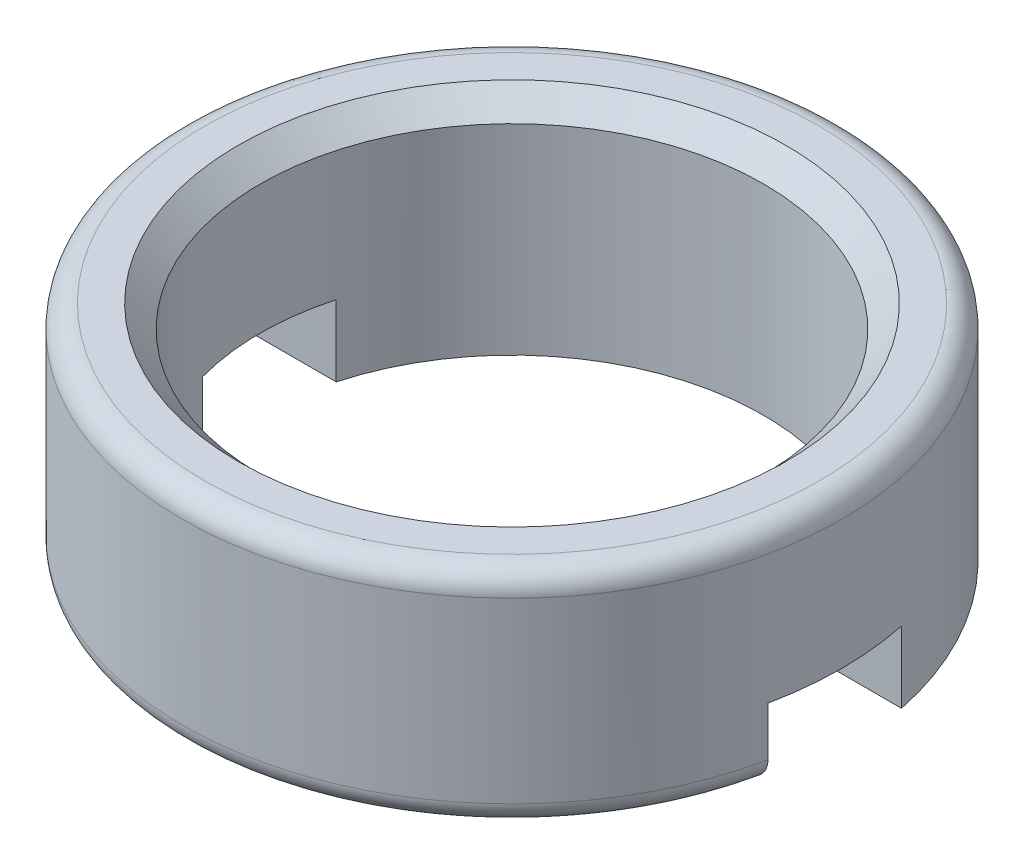
ISO-10303-21;
HEADER;
FILE_DESCRIPTION(('STEP AP214'),'2;1');
FILE_NAME('part.step','',(''),(''),'','','');
FILE_SCHEMA(('AUTOMOTIVE_DESIGN { 1 0 10303 214 1 1 1 1 }'));
ENDSEC;
DATA;
#1=APPLICATION_CONTEXT('core data for automotive mechanical design processes');
#2=APPLICATION_PROTOCOL_DEFINITION('international standard','automotive_design',2000,#1);
#3=PRODUCT_CONTEXT('',#1,'mechanical');
#4=PRODUCT('Part','Part','',(#3));
#5=PRODUCT_RELATED_PRODUCT_CATEGORY('part','',(#4));
#6=PRODUCT_DEFINITION_FORMATION('','',#4);
#7=PRODUCT_DEFINITION_CONTEXT('part definition',#1,'design');
#8=PRODUCT_DEFINITION('design','',#6,#7);
#9=PRODUCT_DEFINITION_SHAPE('','',#8);
#10=(LENGTH_UNIT() NAMED_UNIT(*) SI_UNIT(.MILLI.,.METRE.));
#11=(NAMED_UNIT(*) PLANE_ANGLE_UNIT() SI_UNIT($,.RADIAN.));
#12=(NAMED_UNIT(*) SI_UNIT($,.STERADIAN.) SOLID_ANGLE_UNIT());
#13=UNCERTAINTY_MEASURE_WITH_UNIT(LENGTH_MEASURE(1.E-05),#10,'distance_accuracy_value','');
#14=(GEOMETRIC_REPRESENTATION_CONTEXT(3) GLOBAL_UNCERTAINTY_ASSIGNED_CONTEXT((#13)) GLOBAL_UNIT_ASSIGNED_CONTEXT((#10,
#11,#12)) REPRESENTATION_CONTEXT('',''));
#15=CARTESIAN_POINT('',(0.,0.,0.));
#16=DIRECTION('',(0.,0.,1.));
#17=DIRECTION('',(1.,0.,0.));
#18=AXIS2_PLACEMENT_3D('',#15,#16,#17);
#19=CARTESIAN_POINT('',(0.,0.,0.));
#20=DIRECTION('',(0.,1.,0.));
#21=DIRECTION('',(0.,0.,1.));
#22=AXIS2_PLACEMENT_3D('',#19,#20,#21);
#23=PLANE('',#22);
#24=DIRECTION('',(-1.,0.,0.));
#25=VECTOR('',#24,1.);
#26=CARTESIAN_POINT('',(-13.7487402626277,0.,-1.5));
#27=LINE('',#26,#25);
#28=CARTESIAN_POINT('',(-5.4472470111057,0.,-1.5));
#29=VERTEX_POINT('',#28);
#30=CARTESIAN_POINT('',(-7.24637840579693,0.,-1.5));
#31=VERTEX_POINT('',#30);
#32=EDGE_CURVE('E126',#29,#31,#27,.T.);
#33=ORIENTED_EDGE('',*,*,#32,.T.);
#34=CARTESIAN_POINT('',(0.,0.,0.));
#35=DIRECTION('',(0.,1.,0.));
#36=DIRECTION('',(0.,0.,1.));
#37=AXIS2_PLACEMENT_3D('',#34,#35,#36);
#38=CIRCLE('',#37,7.4);
#39=CARTESIAN_POINT('',(7.24637840579693,0.,-1.5));
#40=VERTEX_POINT('',#39);
#41=EDGE_CURVE('E133',#40,#31,#38,.T.);
#42=ORIENTED_EDGE('',*,*,#41,.F.);
#43=CARTESIAN_POINT('',(5.4472470111057,0.,-1.5));
#44=VERTEX_POINT('',#43);
#45=EDGE_CURVE('E113',#40,#44,#27,.T.);
#46=ORIENTED_EDGE('',*,*,#45,.T.);
#47=CARTESIAN_POINT('',(0.,0.,0.));
#48=DIRECTION('',(0.,1.,0.));
#49=DIRECTION('',(0.,0.,1.));
#50=AXIS2_PLACEMENT_3D('',#47,#48,#49);
#51=CIRCLE('',#50,5.65);
#52=EDGE_CURVE('E141',#44,#29,#51,.T.);
#53=ORIENTED_EDGE('',*,*,#52,.T.);
#54=EDGE_LOOP('',(#33,#42,#46,#53));
#55=FACE_BOUND('',#54,.T.);
#56=ADVANCED_FACE('F35',(#55),#23,.F.);
#57=DIRECTION('',(1.,0.,0.));
#58=VECTOR('',#57,1.);
#59=CARTESIAN_POINT('',(-13.7487402626277,0.,1.5));
#60=LINE('',#59,#58);
#61=CARTESIAN_POINT('',(-6.73498329619309,0.,1.5));
#62=VERTEX_POINT('',#61);
#63=CARTESIAN_POINT('',(-5.96426860562131,0.,1.5));
#64=VERTEX_POINT('',#63);
#65=EDGE_CURVE('E238',#62,#64,#60,.T.);
#66=ORIENTED_EDGE('',*,*,#65,.T.);
#67=CARTESIAN_POINT('',(0.,0.,0.));
#68=DIRECTION('',(0.,1.,0.));
#69=DIRECTION('',(0.,0.,1.));
#70=AXIS2_PLACEMENT_3D('',#67,#68,#69);
#71=CIRCLE('',#70,6.15);
#72=CARTESIAN_POINT('',(5.96426860562131,0.,1.5));
#73=VERTEX_POINT('',#72);
#74=EDGE_CURVE('E159',#64,#73,#71,.T.);
#75=ORIENTED_EDGE('',*,*,#74,.T.);
#76=CARTESIAN_POINT('',(6.73498329619309,0.,1.5));
#77=VERTEX_POINT('',#76);
#78=EDGE_CURVE('E125',#73,#77,#60,.T.);
#79=ORIENTED_EDGE('',*,*,#78,.T.);
#80=CARTESIAN_POINT('',(0.,0.,0.));
#81=DIRECTION('',(0.,1.,0.));
#82=DIRECTION('',(0.,0.,1.));
#83=AXIS2_PLACEMENT_3D('',#80,#81,#82);
#84=CIRCLE('',#83,6.9);
#85=EDGE_CURVE('E157',#77,#62,#84,.F.);
#86=ORIENTED_EDGE('',*,*,#85,.T.);
#87=EDGE_LOOP('',(#66,#75,#79,#86));
#88=FACE_BOUND('',#87,.T.);
#89=ADVANCED_FACE('F207',(#88),#23,.F.);
#90=CARTESIAN_POINT('',(0.,5.,0.));
#91=DIRECTION('',(0.,-1.,0.));
#92=DIRECTION('',(0.,0.,-1.));
#93=AXIS2_PLACEMENT_3D('',#90,#91,#92);
#94=CYLINDRICAL_SURFACE('',#93,7.4);
#95=CARTESIAN_POINT('',(0.,4.5,0.));
#96=DIRECTION('',(0.,1.,0.));
#97=DIRECTION('',(0.,0.,1.));
#98=AXIS2_PLACEMENT_3D('',#95,#96,#97);
#99=CIRCLE('',#98,7.4);
#100=CARTESIAN_POINT('',(0.,4.5,7.4));
#101=VERTEX_POINT('',#100);
#102=EDGE_CURVE('E256',#101,#101,#99,.F.);
#103=ORIENTED_EDGE('',*,*,#102,.T.);
#104=EDGE_LOOP('',(#103));
#105=FACE_BOUND('',#104,.T.);
#106=DIRECTION('',(0.,-1.,0.));
#107=VECTOR('',#106,1.);
#108=CARTESIAN_POINT('',(-7.24637840579693,5.,1.5));
#109=LINE('',#108,#107);
#110=CARTESIAN_POINT('',(-7.24637840579693,0.5,1.5));
#111=VERTEX_POINT('',#110);
#112=CARTESIAN_POINT('',(-7.24637840579693,1.6,1.5));
#113=VERTEX_POINT('',#112);
#114=EDGE_CURVE('E233',#111,#113,#109,.F.);
#115=ORIENTED_EDGE('',*,*,#114,.F.);
#116=CARTESIAN_POINT('',(0.,0.5,0.));
#117=DIRECTION('',(0.,1.,0.));
#118=DIRECTION('',(0.,0.,1.));
#119=AXIS2_PLACEMENT_3D('',#116,#117,#118);
#120=CIRCLE('',#119,7.4);
#121=CARTESIAN_POINT('',(7.24637840579693,0.5,1.5));
#122=VERTEX_POINT('',#121);
#123=EDGE_CURVE('E254',#111,#122,#120,.T.);
#124=ORIENTED_EDGE('',*,*,#123,.T.);
#125=DIRECTION('',(0.,-1.,0.));
#126=VECTOR('',#125,1.);
#127=CARTESIAN_POINT('',(7.24637840579693,5.,1.5));
#128=LINE('',#127,#126);
#129=CARTESIAN_POINT('',(7.24637840579693,1.6,1.5));
#130=VERTEX_POINT('',#129);
#131=EDGE_CURVE('E137',#130,#122,#128,.T.);
#132=ORIENTED_EDGE('',*,*,#131,.F.);
#133=CARTESIAN_POINT('',(0.,1.6,0.));
#134=DIRECTION('',(0.,1.,0.));
#135=DIRECTION('',(0.,0.,1.));
#136=AXIS2_PLACEMENT_3D('',#133,#134,#135);
#137=CIRCLE('',#136,7.4);
#138=CARTESIAN_POINT('',(7.24637840579693,1.6,-1.5));
#139=VERTEX_POINT('',#138);
#140=EDGE_CURVE('E135',#130,#139,#137,.T.);
#141=ORIENTED_EDGE('',*,*,#140,.T.);
#142=DIRECTION('',(0.,-1.,0.));
#143=VECTOR('',#142,1.);
#144=CARTESIAN_POINT('',(7.24637840579693,5.,-1.5));
#145=LINE('',#144,#143);
#146=EDGE_CURVE('E117',#40,#139,#145,.F.);
#147=ORIENTED_EDGE('',*,*,#146,.F.);
#148=ORIENTED_EDGE('',*,*,#41,.T.);
#149=DIRECTION('',(0.,-1.,0.));
#150=VECTOR('',#149,1.);
#151=CARTESIAN_POINT('',(-7.24637840579693,5.,-1.5));
#152=LINE('',#151,#150);
#153=CARTESIAN_POINT('',(-7.24637840579693,1.6,-1.5));
#154=VERTEX_POINT('',#153);
#155=EDGE_CURVE('E136',#154,#31,#152,.T.);
#156=ORIENTED_EDGE('',*,*,#155,.F.);
#157=EDGE_CURVE('E235',#154,#113,#137,.T.);
#158=ORIENTED_EDGE('',*,*,#157,.T.);
#159=EDGE_LOOP('',(#115,#124,#132,#141,#147,#148,#156,#158));
#160=FACE_BOUND('',#159,.T.);
#161=ADVANCED_FACE('F131',(#105,#160),#94,.T.);
#162=CARTESIAN_POINT('',(0.,5.,0.));
#163=DIRECTION('',(0.,-1.,0.));
#164=DIRECTION('',(0.,0.,-1.));
#165=AXIS2_PLACEMENT_3D('',#162,#163,#164);
#166=CYLINDRICAL_SURFACE('',#165,5.65);
#167=CARTESIAN_POINT('',(0.,4.49999999999999,0.));
#168=DIRECTION('',(0.,1.,0.));
#169=DIRECTION('',(0.,0.,1.));
#170=AXIS2_PLACEMENT_3D('',#167,#168,#169);
#171=CIRCLE('',#170,5.65);
#172=CARTESIAN_POINT('',(0.,4.49999999999999,5.65));
#173=VERTEX_POINT('',#172);
#174=EDGE_CURVE('E43',#173,#173,#171,.T.);
#175=ORIENTED_EDGE('',*,*,#174,.T.);
#176=EDGE_LOOP('',(#175));
#177=FACE_BOUND('',#176,.T.);
#178=DIRECTION('',(0.,-1.,0.));
#179=VECTOR('',#178,1.);
#180=CARTESIAN_POINT('',(5.4472470111057,5.,1.5));
#181=LINE('',#180,#179);
#182=CARTESIAN_POINT('',(5.4472470111057,1.6,1.5));
#183=VERTEX_POINT('',#182);
#184=CARTESIAN_POINT('',(5.4472470111057,0.5,1.5));
#185=VERTEX_POINT('',#184);
#186=EDGE_CURVE('E154',#183,#185,#181,.T.);
#187=ORIENTED_EDGE('',*,*,#186,.T.);
#188=CARTESIAN_POINT('',(0.,0.5,0.));
#189=DIRECTION('',(0.,1.,0.));
#190=DIRECTION('',(0.,0.,1.));
#191=AXIS2_PLACEMENT_3D('',#188,#189,#190);
#192=CIRCLE('',#191,5.65);
#193=CARTESIAN_POINT('',(-5.4472470111057,0.5,1.5));
#194=VERTEX_POINT('',#193);
#195=EDGE_CURVE('E58',#185,#194,#192,.F.);
#196=ORIENTED_EDGE('',*,*,#195,.T.);
#197=DIRECTION('',(0.,-1.,0.));
#198=VECTOR('',#197,1.);
#199=CARTESIAN_POINT('',(-5.4472470111057,5.,1.5));
#200=LINE('',#199,#198);
#201=CARTESIAN_POINT('',(-5.4472470111057,1.6,1.5));
#202=VERTEX_POINT('',#201);
#203=EDGE_CURVE('E144',#194,#202,#200,.F.);
#204=ORIENTED_EDGE('',*,*,#203,.T.);
#205=CARTESIAN_POINT('',(0.,1.6,0.));
#206=DIRECTION('',(0.,1.,0.));
#207=DIRECTION('',(0.,0.,1.));
#208=AXIS2_PLACEMENT_3D('',#205,#206,#207);
#209=CIRCLE('',#208,5.65);
#210=CARTESIAN_POINT('',(-5.4472470111057,1.6,-1.5));
#211=VERTEX_POINT('',#210);
#212=EDGE_CURVE('E140',#211,#202,#209,.T.);
#213=ORIENTED_EDGE('',*,*,#212,.F.);
#214=DIRECTION('',(0.,-1.,0.));
#215=VECTOR('',#214,1.);
#216=CARTESIAN_POINT('',(-5.4472470111057,5.,-1.5));
#217=LINE('',#216,#215);
#218=EDGE_CURVE('E151',#211,#29,#217,.T.);
#219=ORIENTED_EDGE('',*,*,#218,.T.);
#220=ORIENTED_EDGE('',*,*,#52,.F.);
#221=DIRECTION('',(0.,-1.,0.));
#222=VECTOR('',#221,1.);
#223=CARTESIAN_POINT('',(5.4472470111057,5.,-1.5));
#224=LINE('',#223,#222);
#225=CARTESIAN_POINT('',(5.4472470111057,1.6,-1.5));
#226=VERTEX_POINT('',#225);
#227=EDGE_CURVE('E120',#44,#226,#224,.F.);
#228=ORIENTED_EDGE('',*,*,#227,.T.);
#229=EDGE_CURVE('E146',#183,#226,#209,.T.);
#230=ORIENTED_EDGE('',*,*,#229,.F.);
#231=EDGE_LOOP('',(#187,#196,#204,#213,#219,#220,#228,#230));
#232=FACE_BOUND('',#231,.T.);
#233=ADVANCED_FACE('F206',(#177,#232),#166,.F.);
#234=CARTESIAN_POINT('',(0.,5.,0.));
#235=DIRECTION('',(0.,1.,0.));
#236=DIRECTION('',(0.,0.,1.));
#237=AXIS2_PLACEMENT_3D('',#234,#235,#236);
#238=PLANE('',#237);
#239=CARTESIAN_POINT('',(0.,5.,0.));
#240=DIRECTION('',(0.,1.,0.));
#241=DIRECTION('',(0.,0.,1.));
#242=AXIS2_PLACEMENT_3D('',#239,#240,#241);
#243=CIRCLE('',#242,6.15000000000001);
#244=CARTESIAN_POINT('',(0.,5.,6.15000000000001));
#245=VERTEX_POINT('',#244);
#246=EDGE_CURVE('E11',#245,#245,#243,.F.);
#247=ORIENTED_EDGE('',*,*,#246,.T.);
#248=EDGE_LOOP('',(#247));
#249=FACE_BOUND('',#248,.T.);
#250=CARTESIAN_POINT('',(0.,5.,0.));
#251=DIRECTION('',(0.,1.,0.));
#252=DIRECTION('',(0.,0.,1.));
#253=AXIS2_PLACEMENT_3D('',#250,#251,#252);
#254=CIRCLE('',#253,6.9);
#255=CARTESIAN_POINT('',(0.,5.,6.9));
#256=VERTEX_POINT('',#255);
#257=EDGE_CURVE('E195',#256,#256,#254,.T.);
#258=ORIENTED_EDGE('',*,*,#257,.T.);
#259=EDGE_LOOP('',(#258));
#260=FACE_BOUND('',#259,.T.);
#261=ADVANCED_FACE('F211',(#249,#260),#238,.T.);
#262=CARTESIAN_POINT('',(13.7487402626277,1.6,1.5));
#263=DIRECTION('',(0.,1.,0.));
#264=DIRECTION('',(0.,0.,1.));
#265=AXIS2_PLACEMENT_3D('',#262,#263,#264);
#266=PLANE('',#265);
#267=DIRECTION('',(-1.,0.,0.));
#268=VECTOR('',#267,1.);
#269=CARTESIAN_POINT('',(-13.7487402626277,1.6,-1.5));
#270=LINE('',#269,#268);
#271=EDGE_CURVE('E228',#211,#154,#270,.T.);
#272=ORIENTED_EDGE('',*,*,#271,.F.);
#273=ORIENTED_EDGE('',*,*,#212,.T.);
#274=DIRECTION('',(1.,0.,0.));
#275=VECTOR('',#274,1.);
#276=CARTESIAN_POINT('',(-13.7487402626277,1.6,1.5));
#277=LINE('',#276,#275);
#278=EDGE_CURVE('E237',#113,#202,#277,.T.);
#279=ORIENTED_EDGE('',*,*,#278,.F.);
#280=ORIENTED_EDGE('',*,*,#157,.F.);
#281=EDGE_LOOP('',(#272,#273,#279,#280));
#282=FACE_BOUND('',#281,.T.);
#283=ADVANCED_FACE('F214',(#282),#266,.F.);
#284=CARTESIAN_POINT('',(-13.7487402626277,1.6,1.5));
#285=DIRECTION('',(0.,0.,-1.));
#286=DIRECTION('',(-1.,0.,0.));
#287=AXIS2_PLACEMENT_3D('',#284,#285,#286);
#288=PLANE('',#287);
#289=ORIENTED_EDGE('',*,*,#203,.F.);
#290=CARTESIAN_POINT('',(-5.4472470111057,0.5,1.5));
#291=CARTESIAN_POINT('',(-5.44721865654353,0.472579999335546,1.5));
#292=CARTESIAN_POINT('',(-5.44958468785448,0.445173572933267,1.5));
#293=CARTESIAN_POINT('',(-5.458888354602,0.391197751948108,1.5));
#294=CARTESIAN_POINT('',(-5.4658175807584,0.364626911698731,1.5));
#295=CARTESIAN_POINT('',(-5.48403282879274,0.31302319140128,1.5));
#296=CARTESIAN_POINT('',(-5.49531928909857,0.287990466413323,1.5));
#297=CARTESIAN_POINT('',(-5.52186729528403,0.240131540818763,1.5));
#298=CARTESIAN_POINT('',(-5.5371293523342,0.217305624474995,1.5));
#299=CARTESIAN_POINT('',(-5.57143211389376,0.174090219625326,1.5));
#300=CARTESIAN_POINT('',(-5.59053001164644,0.153746176722995,1.5));
#301=CARTESIAN_POINT('',(-5.63177366020328,0.116423136103547,1.5));
#302=CARTESIAN_POINT('',(-5.65392019360701,0.0994450051719816,1.5));
#303=CARTESIAN_POINT('',(-5.70142475948531,0.0687372641111311,1.5));
#304=CARTESIAN_POINT('',(-5.7268657220437,0.0551360388314988,1.5));
#305=CARTESIAN_POINT('',(-5.77962307713032,0.032265449001897,1.5));
#306=CARTESIAN_POINT('',(-5.806939136347,0.0229953168450117,1.5));
#307=CARTESIAN_POINT('',(-5.85596990209994,0.0106850033498839,1.5));
#308=CARTESIAN_POINT('',(-5.87744852082027,0.00668194596631475,1.5));
#309=CARTESIAN_POINT('',(-5.92070537034321,0.0013392326078589,1.5));
#310=CARTESIAN_POINT('',(-5.94248316414683,-3.96248657095503E-06,1.5));
#311=CARTESIAN_POINT('',(-5.96426860562131,0.,1.5));
#312=B_SPLINE_CURVE_WITH_KNOTS('',3,(#290,#291,#292,#293,#294,#295,#296,#297,#298,#299,#300,
#301,#302,#303,#304,#305,#306,#307,#308,#309,#310,#311),.UNSPECIFIED.,.F.,.F.,(4,2,2,2,2,2,2,2,
2,2,4),(0.,0.0821374513729526,0.164123957803793,0.246118715924156,0.328124021898044,
0.411457427519352,0.494812265261529,0.5809690962749,0.667110651770398,0.732498131507457,
0.797798550340366),.UNSPECIFIED.);
#313=EDGE_CURVE('E190',#194,#64,#312,.T.);
#314=ORIENTED_EDGE('',*,*,#313,.T.);
#315=ORIENTED_EDGE('',*,*,#65,.F.);
#316=CARTESIAN_POINT('',(-6.73498329619309,0.,1.5));
#317=CARTESIAN_POINT('',(-6.76425817964081,-2.19342776803566E-05,1.5));
#318=CARTESIAN_POINT('',(-6.79353132328341,0.00244839274102724,1.5));
#319=CARTESIAN_POINT('',(-6.85125761613455,0.012227360179828,1.5));
#320=CARTESIAN_POINT('',(-6.87971078170866,0.019535903966283,1.5));
#321=CARTESIAN_POINT('',(-6.93500362915463,0.0388527193332894,1.5));
#322=CARTESIAN_POINT('',(-6.96184202108156,0.0508646921696409,1.5));
#323=CARTESIAN_POINT('',(-7.01307651654304,0.0792745375587574,1.5));
#324=CARTESIAN_POINT('',(-7.03747361030847,0.0956706218524248,1.5));
#325=CARTESIAN_POINT('',(-7.08280016099415,0.132184844633778,1.5));
#326=CARTESIAN_POINT('',(-7.10376924419293,0.15225376122961,1.5));
#327=CARTESIAN_POINT('',(-7.14195445368811,0.19570247589938,1.5));
#328=CARTESIAN_POINT('',(-7.15917000854065,0.219082777211918,1.5));
#329=CARTESIAN_POINT('',(-7.1889592815937,0.267942991810473,1.5));
#330=CARTESIAN_POINT('',(-7.2016246440354,0.293367112861258,1.5));
#331=CARTESIAN_POINT('',(-7.22240677214829,0.34600016326984,1.5));
#332=CARTESIAN_POINT('',(-7.23052761863195,0.373207466784818,1.5));
#333=CARTESIAN_POINT('',(-7.23961482541372,0.417194055967998,1.5));
#334=CARTESIAN_POINT('',(-7.24214983809906,0.43366486133373,1.5));
#335=CARTESIAN_POINT('',(-7.2455310576269,0.466754488919006,1.5));
#336=CARTESIAN_POINT('',(-7.24637973131355,0.483373059155743,1.5));
#337=CARTESIAN_POINT('',(-7.24637840579782,0.499999999999815,1.5));
#338=B_SPLINE_CURVE_WITH_KNOTS('',3,(#316,#317,#318,#319,#320,#321,#322,#323,#324,#325,#326,
#327,#328,#329,#330,#331,#332,#333,#334,#335,#336,#337),.UNSPECIFIED.,.F.,.F.,(4,2,2,2,2,2,2,2,
2,2,4),(0.,0.0877189192426712,0.175436086529411,0.263222420007344,0.350973000319704,
0.437623846052012,0.524287874466903,0.609093009099696,0.693821869061419,0.743737742041637,
0.79358054217184),.UNSPECIFIED.);
#339=EDGE_CURVE('E50',#62,#111,#338,.T.);
#340=ORIENTED_EDGE('',*,*,#339,.T.);
#341=ORIENTED_EDGE('',*,*,#114,.T.);
#342=ORIENTED_EDGE('',*,*,#278,.T.);
#343=EDGE_LOOP('',(#289,#314,#315,#340,#341,#342));
#344=FACE_BOUND('',#343,.T.);
#345=ADVANCED_FACE('F220',(#344),#288,.T.);
#346=CARTESIAN_POINT('',(-13.7487402626277,1.6,-1.5));
#347=DIRECTION('',(0.,0.,1.));
#348=DIRECTION('',(1.,0.,0.));
#349=AXIS2_PLACEMENT_3D('',#346,#347,#348);
#350=PLANE('',#349);
#351=ORIENTED_EDGE('',*,*,#155,.T.);
#352=ORIENTED_EDGE('',*,*,#32,.F.);
#353=ORIENTED_EDGE('',*,*,#218,.F.);
#354=ORIENTED_EDGE('',*,*,#271,.T.);
#355=EDGE_LOOP('',(#351,#352,#353,#354));
#356=FACE_BOUND('',#355,.T.);
#357=ADVANCED_FACE('F218',(#356),#350,.T.);
#358=ORIENTED_EDGE('',*,*,#146,.T.);
#359=EDGE_CURVE('E244',#139,#226,#270,.T.);
#360=ORIENTED_EDGE('',*,*,#359,.T.);
#361=ORIENTED_EDGE('',*,*,#227,.F.);
#362=ORIENTED_EDGE('',*,*,#45,.F.);
#363=EDGE_LOOP('',(#358,#360,#361,#362));
#364=FACE_BOUND('',#363,.T.);
#365=ADVANCED_FACE('F115',(#364),#350,.T.);
#366=ORIENTED_EDGE('',*,*,#78,.F.);
#367=CARTESIAN_POINT('',(5.96426860562131,0.,1.5));
#368=CARTESIAN_POINT('',(5.93448837348043,-2.02648203604191E-05,1.5));
#369=CARTESIAN_POINT('',(5.90471223635012,0.00250125022505912,1.5));
#370=CARTESIAN_POINT('',(5.84599406553517,0.012468717370003,1.5));
#371=CARTESIAN_POINT('',(5.81705206752932,0.019914879787138,1.5));
#372=CARTESIAN_POINT('',(5.76081177666995,0.0395791357132278,1.5));
#373=CARTESIAN_POINT('',(5.73351460783137,0.0518004506388206,1.5));
#374=CARTESIAN_POINT('',(5.6814023606042,0.0807034279726633,1.5));
#375=CARTESIAN_POINT('',(5.65658635520293,0.0973834159095531,1.5));
#376=CARTESIAN_POINT('',(5.61049587650892,0.134543836115865,1.5));
#377=CARTESIAN_POINT('',(5.58918076922453,0.154973806336125,1.5));
#378=CARTESIAN_POINT('',(5.55041374523583,0.199232011692524,1.5));
#379=CARTESIAN_POINT('',(5.53296220113142,0.223060574222981,1.5));
#380=CARTESIAN_POINT('',(5.50302131478718,0.272634720996027,1.5));
#381=CARTESIAN_POINT('',(5.49039363328441,0.298296852600594,1.5));
#382=CARTESIAN_POINT('',(5.46980254787104,0.351415579920873,1.5));
#383=CARTESIAN_POINT('',(5.46183394310802,0.378870136561596,1.5));
#384=CARTESIAN_POINT('',(5.45331572111313,0.422140649391764,1.5));
#385=CARTESIAN_POINT('',(5.45104122930103,0.437635868168626,1.5));
#386=CARTESIAN_POINT('',(5.44800748750709,0.46875141644258,1.5));
#387=CARTESIAN_POINT('',(5.44724606719641,0.48437153442565,1.5));
#388=CARTESIAN_POINT('',(5.44724701110548,0.499999999999956,1.5));
#389=B_SPLINE_CURVE_WITH_KNOTS('',3,(#367,#368,#369,#370,#371,#372,#373,#374,#375,#376,#377,
#378,#379,#380,#381,#382,#383,#384,#385,#386,#387,#388),.UNSPECIFIED.,.F.,.F.,(4,2,2,2,2,2,2,2,
2,2,4),(0.,0.0892293112132101,0.178462433401308,0.267755858327284,0.357015795772932,
0.44515257364634,0.533297847682692,0.618681453466569,0.703969564028407,0.750887424033341,
0.797737936990993),.UNSPECIFIED.);
#390=EDGE_CURVE('E168',#73,#185,#389,.T.);
#391=ORIENTED_EDGE('',*,*,#390,.T.);
#392=ORIENTED_EDGE('',*,*,#186,.F.);
#393=EDGE_CURVE('E241',#183,#130,#277,.T.);
#394=ORIENTED_EDGE('',*,*,#393,.T.);
#395=ORIENTED_EDGE('',*,*,#131,.T.);
#396=CARTESIAN_POINT('',(7.24637840579693,0.5,1.5));
#397=CARTESIAN_POINT('',(7.24640455684024,0.472301776338327,1.5));
#398=CARTESIAN_POINT('',(7.2440297044604,0.444613921243251,1.5));
#399=CARTESIAN_POINT('',(7.23467479578193,0.390064254962551,1.5));
#400=CARTESIAN_POINT('',(7.22770094809862,0.363201381154175,1.5));
#401=CARTESIAN_POINT('',(7.20934123212355,0.311020666868768,1.5));
#402=CARTESIAN_POINT('',(7.19795408762445,0.285703275757453,1.5));
#403=CARTESIAN_POINT('',(7.17112890987737,0.237318332484099,1.5));
#404=CARTESIAN_POINT('',(7.15569095759656,0.21425073536603,1.5));
#405=CARTESIAN_POINT('',(7.12107569791583,0.170790656511223,1.5));
#406=CARTESIAN_POINT('',(7.10186727647648,0.150422972984381,1.5));
#407=CARTESIAN_POINT('',(7.06035986254292,0.113122506650058,1.5));
#408=CARTESIAN_POINT('',(7.03806020154278,0.096190468785812,1.5));
#409=CARTESIAN_POINT('',(6.99053556294616,0.0658829994720198,1.5));
#410=CARTESIAN_POINT('',(6.9652611212874,0.0525852183177252,1.5));
#411=CARTESIAN_POINT('',(6.91287265829586,0.0303259559202552,1.5));
#412=CARTESIAN_POINT('',(6.88575908856569,0.0213634145114844,1.5));
#413=CARTESIAN_POINT('',(6.83795785920511,0.00979362998054914,1.5));
#414=CARTESIAN_POINT('',(6.81752060907877,0.00612221343179386,1.5));
#415=CARTESIAN_POINT('',(6.77638541441163,0.00122545508438569,1.5));
#416=CARTESIAN_POINT('',(6.75568789482869,-3.45608555482346E-06,1.5));
#417=CARTESIAN_POINT('',(6.73498329619309,0.,1.5));
#418=B_SPLINE_CURVE_WITH_KNOTS('',3,(#396,#397,#398,#399,#400,#401,#402,#403,#404,#405,#406,
#407,#408,#409,#410,#411,#412,#413,#414,#415,#416,#417),.UNSPECIFIED.,.F.,.F.,(4,2,2,2,2,2,2,2,
2,2,4),(0.,0.0829775713838851,0.165843352246403,0.248733113576026,0.331621218239146,
0.415224484367755,0.498845858676809,0.584134629834455,0.669402533405272,0.731556820404208,
0.793620210847483),.UNSPECIFIED.);
#419=EDGE_CURVE('E162',#122,#77,#418,.T.);
#420=ORIENTED_EDGE('',*,*,#419,.T.);
#421=EDGE_LOOP('',(#366,#391,#392,#394,#395,#420));
#422=FACE_BOUND('',#421,.T.);
#423=ADVANCED_FACE('F174',(#422),#288,.T.);
#424=ORIENTED_EDGE('',*,*,#393,.F.);
#425=ORIENTED_EDGE('',*,*,#229,.T.);
#426=ORIENTED_EDGE('',*,*,#359,.F.);
#427=ORIENTED_EDGE('',*,*,#140,.F.);
#428=EDGE_LOOP('',(#424,#425,#426,#427));
#429=FACE_BOUND('',#428,.T.);
#430=ADVANCED_FACE('F201',(#429),#266,.F.);
#431=CARTESIAN_POINT('',(0.,0.5,0.));
#432=DIRECTION('',(0.,1.,0.));
#433=DIRECTION('',(0.,0.,1.));
#434=AXIS2_PLACEMENT_3D('',#431,#432,#433);
#435=TOROIDAL_SURFACE('',#434,6.15,0.5);
#436=ORIENTED_EDGE('',*,*,#313,.F.);
#437=ORIENTED_EDGE('',*,*,#195,.F.);
#438=ORIENTED_EDGE('',*,*,#390,.F.);
#439=ORIENTED_EDGE('',*,*,#74,.F.);
#440=EDGE_LOOP('',(#436,#437,#438,#439));
#441=FACE_BOUND('',#440,.T.);
#442=ADVANCED_FACE('F197',(#441),#435,.T.);
#443=CARTESIAN_POINT('',(0.,4.5,0.));
#444=DIRECTION('',(0.,1.,0.));
#445=DIRECTION('',(0.,0.,1.));
#446=AXIS2_PLACEMENT_3D('',#443,#444,#445);
#447=TOROIDAL_SURFACE('',#446,6.9,0.5);
#448=ORIENTED_EDGE('',*,*,#102,.F.);
#449=EDGE_LOOP('',(#448));
#450=FACE_BOUND('',#449,.T.);
#451=ORIENTED_EDGE('',*,*,#257,.F.);
#452=EDGE_LOOP('',(#451));
#453=FACE_BOUND('',#452,.T.);
#454=ADVANCED_FACE('F182',(#450,#453),#447,.T.);
#455=CARTESIAN_POINT('',(0.,0.5,0.));
#456=DIRECTION('',(0.,1.,0.));
#457=DIRECTION('',(0.,0.,1.));
#458=AXIS2_PLACEMENT_3D('',#455,#456,#457);
#459=TOROIDAL_SURFACE('',#458,6.9,0.5);
#460=ORIENTED_EDGE('',*,*,#339,.F.);
#461=ORIENTED_EDGE('',*,*,#85,.F.);
#462=ORIENTED_EDGE('',*,*,#419,.F.);
#463=ORIENTED_EDGE('',*,*,#123,.F.);
#464=EDGE_LOOP('',(#460,#461,#462,#463));
#465=FACE_BOUND('',#464,.T.);
#466=ADVANCED_FACE('F178',(#465),#459,.T.);
#467=CARTESIAN_POINT('',(0.,4.49999999999999,0.));
#468=DIRECTION('',(0.,1.,0.));
#469=DIRECTION('',(0.,0.,1.));
#470=AXIS2_PLACEMENT_3D('',#467,#468,#469);
#471=CONICAL_SURFACE('',#470,5.65,0.785398163397452);
#472=ORIENTED_EDGE('',*,*,#246,.F.);
#473=EDGE_LOOP('',(#472));
#474=FACE_BOUND('',#473,.T.);
#475=ORIENTED_EDGE('',*,*,#174,.F.);
#476=EDGE_LOOP('',(#475));
#477=FACE_BOUND('',#476,.T.);
#478=ADVANCED_FACE('F37',(#474,#477),#471,.F.);
#479=CLOSED_SHELL('',(#56,#89,#161,#233,#261,#283,#345,#357,#365,#423,#430,#442,#454,#466,#478));
#480=MANIFOLD_SOLID_BREP('B2',#479);
#481=ADVANCED_BREP_SHAPE_REPRESENTATION('',(#18,#480),#14);
#482=SHAPE_DEFINITION_REPRESENTATION(#9,#481);
ENDSEC;
END-ISO-10303-21;
